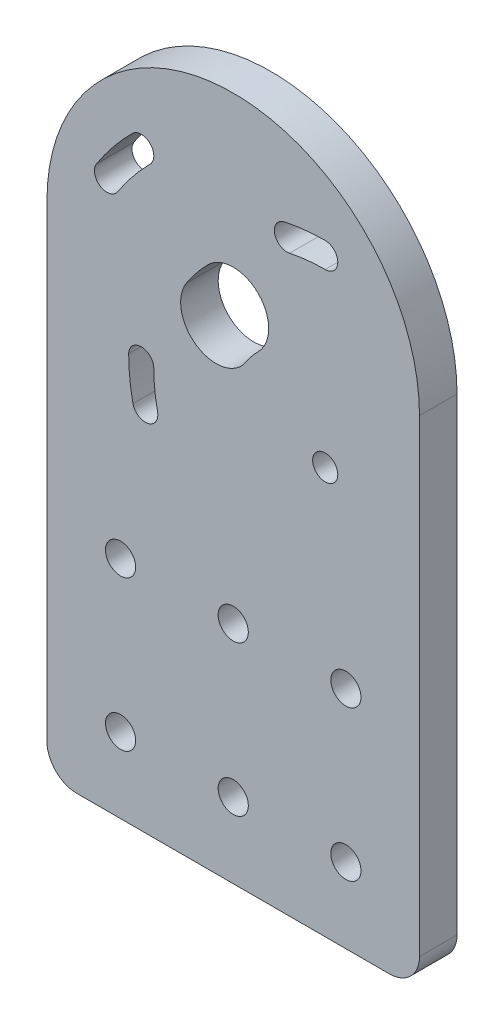
ISO-10303-21;
HEADER;
FILE_DESCRIPTION(('STEP AP214'),'2;1');
FILE_NAME('part.step','',(''),(''),'','','');
FILE_SCHEMA(('AUTOMOTIVE_DESIGN { 1 0 10303 214 1 1 1 1 }'));
ENDSEC;
DATA;
#1=APPLICATION_CONTEXT('core data for automotive mechanical design processes');
#2=APPLICATION_PROTOCOL_DEFINITION('international standard','automotive_design',2000,#1);
#3=PRODUCT_CONTEXT('',#1,'mechanical');
#4=PRODUCT('Part','Part','',(#3));
#5=PRODUCT_RELATED_PRODUCT_CATEGORY('part','',(#4));
#6=PRODUCT_DEFINITION_FORMATION('','',#4);
#7=PRODUCT_DEFINITION_CONTEXT('part definition',#1,'design');
#8=PRODUCT_DEFINITION('design','',#6,#7);
#9=PRODUCT_DEFINITION_SHAPE('','',#8);
#10=(LENGTH_UNIT() NAMED_UNIT(*) SI_UNIT(.MILLI.,.METRE.));
#11=(NAMED_UNIT(*) PLANE_ANGLE_UNIT() SI_UNIT($,.RADIAN.));
#12=(NAMED_UNIT(*) SI_UNIT($,.STERADIAN.) SOLID_ANGLE_UNIT());
#13=UNCERTAINTY_MEASURE_WITH_UNIT(LENGTH_MEASURE(1.E-05),#10,'distance_accuracy_value','');
#14=(GEOMETRIC_REPRESENTATION_CONTEXT(3) GLOBAL_UNCERTAINTY_ASSIGNED_CONTEXT((#13)) GLOBAL_UNIT_ASSIGNED_CONTEXT((#10,
#11,#12)) REPRESENTATION_CONTEXT('',''));
#15=CARTESIAN_POINT('',(0.,0.,0.));
#16=DIRECTION('',(0.,0.,1.));
#17=DIRECTION('',(1.,0.,0.));
#18=AXIS2_PLACEMENT_3D('',#15,#16,#17);
#19=CARTESIAN_POINT('',(0.,84.3,6.35));
#20=DIRECTION('',(0.,0.,1.));
#21=DIRECTION('',(1.,0.,0.));
#22=AXIS2_PLACEMENT_3D('',#19,#20,#21);
#23=PLANE('',#22);
#24=CARTESIAN_POINT('',(-19.0499999999999,12.7,6.35));
#25=DIRECTION('',(0.,0.,1.));
#26=DIRECTION('',(1.,0.,0.));
#27=AXIS2_PLACEMENT_3D('',#24,#25,#26);
#28=CIRCLE('',#27,2.5527);
#29=CARTESIAN_POINT('',(-16.4972999999998,12.7,6.35));
#30=VERTEX_POINT('',#29);
#31=EDGE_CURVE('E325',#30,#30,#28,.T.);
#32=ORIENTED_EDGE('',*,*,#31,.F.);
#33=EDGE_LOOP('',(#32));
#34=FACE_BOUND('',#33,.T.);
#35=CARTESIAN_POINT('',(-1.49186218934005E-13,38.1,6.35));
#36=DIRECTION('',(0.,0.,1.));
#37=DIRECTION('',(1.,0.,0.));
#38=AXIS2_PLACEMENT_3D('',#35,#36,#37);
#39=CIRCLE('',#38,2.5527);
#40=CARTESIAN_POINT('',(2.55269999999985,38.1,6.35));
#41=VERTEX_POINT('',#40);
#42=EDGE_CURVE('E337',#41,#41,#39,.T.);
#43=ORIENTED_EDGE('',*,*,#42,.F.);
#44=EDGE_LOOP('',(#43));
#45=FACE_BOUND('',#44,.T.);
#46=CARTESIAN_POINT('',(19.0500000000001,12.7,6.35));
#47=DIRECTION('',(0.,0.,1.));
#48=DIRECTION('',(1.,0.,0.));
#49=AXIS2_PLACEMENT_3D('',#46,#47,#48);
#50=CIRCLE('',#49,2.5527);
#51=CARTESIAN_POINT('',(21.6027000000002,12.7,6.35));
#52=VERTEX_POINT('',#51);
#53=EDGE_CURVE('E349',#52,#52,#50,.T.);
#54=ORIENTED_EDGE('',*,*,#53,.F.);
#55=EDGE_LOOP('',(#54));
#56=FACE_BOUND('',#55,.T.);
#57=DIRECTION('',(0.,-1.,0.));
#58=VECTOR('',#57,1.);
#59=CARTESIAN_POINT('',(-31.499999992,84.3,6.35));
#60=LINE('',#59,#58);
#61=CARTESIAN_POINT('',(-31.499999992,84.3,6.35));
#62=VERTEX_POINT('',#61);
#63=CARTESIAN_POINT('',(-31.499999992,5.08,6.35));
#64=VERTEX_POINT('',#63);
#65=EDGE_CURVE('E364',#62,#64,#60,.T.);
#66=ORIENTED_EDGE('',*,*,#65,.T.);
#67=CARTESIAN_POINT('',(-26.419999992,5.08,6.35));
#68=DIRECTION('',(0.,0.,1.));
#69=DIRECTION('',(1.,0.,0.));
#70=AXIS2_PLACEMENT_3D('',#67,#68,#69);
#71=CIRCLE('',#70,5.08);
#72=CARTESIAN_POINT('',(-26.419999992,0.,6.35));
#73=VERTEX_POINT('',#72);
#74=EDGE_CURVE('E41',#64,#73,#71,.T.);
#75=ORIENTED_EDGE('',*,*,#74,.T.);
#76=DIRECTION('',(1.,0.,0.));
#77=VECTOR('',#76,1.);
#78=CARTESIAN_POINT('',(-31.499999992,0.,6.35));
#79=LINE('',#78,#77);
#80=CARTESIAN_POINT('',(26.419999992,0.,6.35));
#81=VERTEX_POINT('',#80);
#82=EDGE_CURVE('E367',#73,#81,#79,.T.);
#83=ORIENTED_EDGE('',*,*,#82,.T.);
#84=CARTESIAN_POINT('',(26.419999992,5.07999999999999,6.35));
#85=DIRECTION('',(0.,0.,1.));
#86=DIRECTION('',(1.,0.,0.));
#87=AXIS2_PLACEMENT_3D('',#84,#85,#86);
#88=CIRCLE('',#87,5.08);
#89=CARTESIAN_POINT('',(31.499999992,5.07999999999999,6.35));
#90=VERTEX_POINT('',#89);
#91=EDGE_CURVE('E48',#81,#90,#88,.T.);
#92=ORIENTED_EDGE('',*,*,#91,.T.);
#93=DIRECTION('',(0.,1.,0.));
#94=VECTOR('',#93,1.);
#95=CARTESIAN_POINT('',(31.499999992,0.,6.35));
#96=LINE('',#95,#94);
#97=CARTESIAN_POINT('',(31.499999992,84.3,6.35));
#98=VERTEX_POINT('',#97);
#99=EDGE_CURVE('E369',#90,#98,#96,.T.);
#100=ORIENTED_EDGE('',*,*,#99,.T.);
#101=CARTESIAN_POINT('',(0.,84.3,6.35));
#102=DIRECTION('',(0.,0.,1.));
#103=DIRECTION('',(1.,0.,0.));
#104=AXIS2_PLACEMENT_3D('',#101,#102,#103);
#105=CIRCLE('',#104,31.499999992);
#106=EDGE_CURVE('E361',#98,#62,#105,.T.);
#107=ORIENTED_EDGE('',*,*,#106,.T.);
#108=EDGE_LOOP('',(#66,#75,#83,#92,#100,#107));
#109=FACE_BOUND('',#108,.T.);
#110=CARTESIAN_POINT('',(15.556349186104,68.743650813896,6.35));
#111=DIRECTION('',(0.,0.,1.));
#112=DIRECTION('',(1.,0.,0.));
#113=AXIS2_PLACEMENT_3D('',#110,#111,#112);
#114=CIRCLE('',#113,2.125);
#115=CARTESIAN_POINT('',(17.6813491861041,68.743650813896,6.35));
#116=VERTEX_POINT('',#115);
#117=EDGE_CURVE('E355',#116,#116,#114,.T.);
#118=ORIENTED_EDGE('',*,*,#117,.F.);
#119=EDGE_LOOP('',(#118));
#120=FACE_BOUND('',#119,.T.);
#121=CARTESIAN_POINT('',(1.49186218934005E-13,12.7,6.35));
#122=DIRECTION('',(0.,0.,1.));
#123=DIRECTION('',(1.,0.,0.));
#124=AXIS2_PLACEMENT_3D('',#121,#122,#123);
#125=CIRCLE('',#124,2.5527);
#126=CARTESIAN_POINT('',(2.55270000000015,12.7,6.35));
#127=VERTEX_POINT('',#126);
#128=EDGE_CURVE('E343',#127,#127,#125,.T.);
#129=ORIENTED_EDGE('',*,*,#128,.F.);
#130=EDGE_LOOP('',(#129));
#131=FACE_BOUND('',#130,.T.);
#132=CARTESIAN_POINT('',(19.0499999999999,38.1,6.35));
#133=DIRECTION('',(0.,0.,1.));
#134=DIRECTION('',(1.,0.,0.));
#135=AXIS2_PLACEMENT_3D('',#132,#133,#134);
#136=CIRCLE('',#135,2.5527);
#137=CARTESIAN_POINT('',(21.6026999999999,38.1,6.35));
#138=VERTEX_POINT('',#137);
#139=EDGE_CURVE('E331',#138,#138,#136,.T.);
#140=ORIENTED_EDGE('',*,*,#139,.F.);
#141=EDGE_LOOP('',(#140));
#142=FACE_BOUND('',#141,.T.);
#143=CARTESIAN_POINT('',(-19.0500000000001,38.1,6.35));
#144=DIRECTION('',(0.,0.,1.));
#145=DIRECTION('',(1.,0.,0.));
#146=AXIS2_PLACEMENT_3D('',#143,#144,#145);
#147=CIRCLE('',#146,2.5527);
#148=CARTESIAN_POINT('',(-16.4973000000002,38.1,6.35));
#149=VERTEX_POINT('',#148);
#150=EDGE_CURVE('E319',#149,#149,#147,.T.);
#151=ORIENTED_EDGE('',*,*,#150,.F.);
#152=EDGE_LOOP('',(#151));
#153=FACE_BOUND('',#152,.T.);
#154=CARTESIAN_POINT('',(15.556349186104,68.743650813896,6.35));
#155=DIRECTION('',(0.,0.,1.));
#156=DIRECTION('',(1.,0.,0.));
#157=AXIS2_PLACEMENT_3D('',#154,#155,#156);
#158=CIRCLE('',#157,33.2376983722081);
#159=CARTESIAN_POINT('',(15.556349186104,101.981349186104,6.35));
#160=VERTEX_POINT('',#159);
#161=CARTESIAN_POINT('',(8.64584311864779,101.255025730585,6.35));
#162=VERTEX_POINT('',#161);
#163=EDGE_CURVE('E290',#160,#162,#158,.T.);
#164=ORIENTED_EDGE('',*,*,#163,.F.);
#165=CARTESIAN_POINT('',(15.556349186104,99.856349186104,6.35));
#166=DIRECTION('',(0.,0.,1.));
#167=DIRECTION('',(1.,0.,0.));
#168=AXIS2_PLACEMENT_3D('',#165,#166,#167);
#169=CIRCLE('',#168,2.125);
#170=CARTESIAN_POINT('',(15.556349186104,97.731349186104,6.35));
#171=VERTEX_POINT('',#170);
#172=EDGE_CURVE('E288',#171,#160,#169,.T.);
#173=ORIENTED_EDGE('',*,*,#172,.F.);
#174=CARTESIAN_POINT('',(15.556349186104,68.743650813896,6.35));
#175=DIRECTION('',(0.,0.,-1.));
#176=DIRECTION('',(1.,0.,0.));
#177=AXIS2_PLACEMENT_3D('',#174,#175,#176);
#178=CIRCLE('',#177,28.9876983722081);
#179=CARTESIAN_POINT('',(9.52946780462324,97.0978984274666,6.35));
#180=VERTEX_POINT('',#179);
#181=EDGE_CURVE('E296',#180,#171,#178,.T.);
#182=ORIENTED_EDGE('',*,*,#181,.F.);
#183=CARTESIAN_POINT('',(9.08765546163552,99.1764620790259,6.35));
#184=DIRECTION('',(0.,0.,1.));
#185=DIRECTION('',(1.,0.,0.));
#186=AXIS2_PLACEMENT_3D('',#183,#184,#185);
#187=CIRCLE('',#186,2.125);
#188=EDGE_CURVE('E293',#162,#180,#187,.T.);
#189=ORIENTED_EDGE('',*,*,#188,.F.);
#190=EDGE_LOOP('',(#164,#173,#182,#189));
#191=FACE_BOUND('',#190,.T.);
#192=CARTESIAN_POINT('',(15.556349186104,68.743650813896,6.35));
#193=DIRECTION('',(0.,0.,1.));
#194=DIRECTION('',(1.,0.,0.));
#195=AXIS2_PLACEMENT_3D('',#192,#193,#194);
#196=CIRCLE('',#195,33.2376983722081);
#197=CARTESIAN_POINT('',(-17.681349186104,68.743650813896,6.35));
#198=VERTEX_POINT('',#197);
#199=CARTESIAN_POINT('',(-16.9550257305853,61.8331447464397,6.35));
#200=VERTEX_POINT('',#199);
#201=EDGE_CURVE('E259',#198,#200,#196,.T.);
#202=ORIENTED_EDGE('',*,*,#201,.F.);
#203=CARTESIAN_POINT('',(-15.5563491861041,68.743650813896,6.35));
#204=DIRECTION('',(0.,0.,1.));
#205=DIRECTION('',(1.,0.,0.));
#206=AXIS2_PLACEMENT_3D('',#203,#204,#205);
#207=CIRCLE('',#206,2.125);
#208=CARTESIAN_POINT('',(-13.431349186104,68.7436508138959,6.35));
#209=VERTEX_POINT('',#208);
#210=EDGE_CURVE('E257',#209,#198,#207,.T.);
#211=ORIENTED_EDGE('',*,*,#210,.F.);
#212=CARTESIAN_POINT('',(15.556349186104,68.743650813896,6.35));
#213=DIRECTION('',(0.,0.,-1.));
#214=DIRECTION('',(1.,0.,0.));
#215=AXIS2_PLACEMENT_3D('',#212,#213,#214);
#216=CIRCLE('',#215,28.9876983722081);
#217=CARTESIAN_POINT('',(-12.7978984274666,62.7167694324151,6.35));
#218=VERTEX_POINT('',#217);
#219=EDGE_CURVE('E265',#218,#209,#216,.T.);
#220=ORIENTED_EDGE('',*,*,#219,.F.);
#221=CARTESIAN_POINT('',(-14.8764620790259,62.2749570894274,6.35));
#222=DIRECTION('',(0.,0.,1.));
#223=DIRECTION('',(1.,0.,0.));
#224=AXIS2_PLACEMENT_3D('',#221,#222,#223);
#225=CIRCLE('',#224,2.125);
#226=EDGE_CURVE('E262',#200,#218,#225,.T.);
#227=ORIENTED_EDGE('',*,*,#226,.F.);
#228=EDGE_LOOP('',(#202,#211,#220,#227));
#229=FACE_BOUND('',#228,.T.);
#230=CARTESIAN_POINT('',(15.556349186104,68.743650813896,6.35));
#231=DIRECTION('',(0.,0.,1.));
#232=DIRECTION('',(1.,0.,0.));
#233=AXIS2_PLACEMENT_3D('',#230,#231,#232);
#234=CIRCLE('',#233,46.1249999999999);
#235=CARTESIAN_POINT('',(-17.0589510961254,101.358951096125,6.35));
#236=VERTEX_POINT('',#235);
#237=CARTESIAN_POINT('',(-23.1273307603784,93.8651263039643,6.35));
#238=VERTEX_POINT('',#237);
#239=EDGE_CURVE('E228',#236,#238,#234,.T.);
#240=ORIENTED_EDGE('',*,*,#239,.F.);
#241=CARTESIAN_POINT('',(-15.556349186104,99.856349186104,6.35));
#242=DIRECTION('',(0.,0.,1.));
#243=DIRECTION('',(1.,0.,0.));
#244=AXIS2_PLACEMENT_3D('',#241,#242,#243);
#245=CIRCLE('',#244,2.12499999999997);
#246=CARTESIAN_POINT('',(-14.0537472760826,98.3537472760826,6.35));
#247=VERTEX_POINT('',#246);
#248=EDGE_CURVE('E226',#247,#236,#245,.T.);
#249=ORIENTED_EDGE('',*,*,#248,.F.);
#250=CARTESIAN_POINT('',(15.556349186104,68.743650813896,6.35));
#251=DIRECTION('',(0.,0.,-1.));
#252=DIRECTION('',(1.,0.,0.));
#253=AXIS2_PLACEMENT_3D('',#250,#251,#252);
#254=CIRCLE('',#253,41.875);
#255=CARTESIAN_POINT('',(-19.5629808466104,91.5504104051504,6.35));
#256=VERTEX_POINT('',#255);
#257=EDGE_CURVE('E234',#256,#247,#254,.T.);
#258=ORIENTED_EDGE('',*,*,#257,.F.);
#259=CARTESIAN_POINT('',(-21.3451558034944,92.7077683545573,6.35));
#260=DIRECTION('',(0.,0.,1.));
#261=DIRECTION('',(1.,0.,0.));
#262=AXIS2_PLACEMENT_3D('',#259,#260,#261);
#263=CIRCLE('',#262,2.125);
#264=EDGE_CURVE('E231',#238,#256,#263,.T.);
#265=ORIENTED_EDGE('',*,*,#264,.F.);
#266=EDGE_LOOP('',(#240,#249,#258,#265));
#267=FACE_BOUND('',#266,.T.);
#268=CARTESIAN_POINT('',(15.556349186104,68.743650813896,6.35));
#269=DIRECTION('',(0.,0.,1.));
#270=DIRECTION('',(1.,0.,0.));
#271=AXIS2_PLACEMENT_3D('',#268,#269,#270);
#272=CIRCLE('',#271,28.);
#273=CARTESIAN_POINT('',(-4.24264068711929,88.5426406871192,6.35));
#274=VERTEX_POINT('',#273);
#275=CARTESIAN_POINT('',(-7.92642671636774,83.9935437943168,6.35));
#276=VERTEX_POINT('',#275);
#277=EDGE_CURVE('E195',#274,#276,#272,.T.);
#278=ORIENTED_EDGE('',*,*,#277,.F.);
#279=CARTESIAN_POINT('',(0.,84.3,6.35));
#280=DIRECTION('',(0.,0.,1.));
#281=DIRECTION('',(1.,0.,0.));
#282=AXIS2_PLACEMENT_3D('',#279,#280,#281);
#283=CIRCLE('',#282,6.);
#284=CARTESIAN_POINT('',(4.24264068711928,80.0573593128807,6.35));
#285=VERTEX_POINT('',#284);
#286=EDGE_CURVE('E185',#285,#274,#283,.T.);
#287=ORIENTED_EDGE('',*,*,#286,.F.);
#288=CARTESIAN_POINT('',(15.556349186104,68.743650813896,6.35));
#289=DIRECTION('',(0.,0.,-1.));
#290=DIRECTION('',(1.,0.,0.));
#291=AXIS2_PLACEMENT_3D('',#288,#289,#290);
#292=CIRCLE('',#291,16.);
#293=CARTESIAN_POINT('',(2.1376200989773,77.4578753741364,6.35));
#294=VERTEX_POINT('',#293);
#295=EDGE_CURVE('E210',#294,#285,#292,.T.);
#296=ORIENTED_EDGE('',*,*,#295,.F.);
#297=CARTESIAN_POINT('',(-2.89440330869522,80.7257095842266,6.35));
#298=DIRECTION('',(0.,0.,1.));
#299=DIRECTION('',(1.,0.,0.));
#300=AXIS2_PLACEMENT_3D('',#297,#298,#299);
#301=CIRCLE('',#300,6.);
#302=EDGE_CURVE('E208',#276,#294,#301,.T.);
#303=ORIENTED_EDGE('',*,*,#302,.F.);
#304=EDGE_LOOP('',(#278,#287,#296,#303));
#305=FACE_BOUND('',#304,.T.);
#306=ADVANCED_FACE('F33',(#34,#45,#56,#109,#120,#131,#142,#153,#191,#229,#267,#305),#23,.T.);
#307=CARTESIAN_POINT('',(0.,84.3,0.));
#308=DIRECTION('',(0.,0.,1.));
#309=DIRECTION('',(1.,0.,0.));
#310=AXIS2_PLACEMENT_3D('',#307,#308,#309);
#311=PLANE('',#310);
#312=CARTESIAN_POINT('',(-15.556349186104,99.856349186104,0.));
#313=DIRECTION('',(0.,0.,1.));
#314=DIRECTION('',(1.,0.,0.));
#315=AXIS2_PLACEMENT_3D('',#312,#313,#314);
#316=CIRCLE('',#315,2.12499999999997);
#317=CARTESIAN_POINT('',(-14.0537472760826,98.3537472760826,0.));
#318=VERTEX_POINT('',#317);
#319=CARTESIAN_POINT('',(-17.0589510961254,101.358951096125,0.));
#320=VERTEX_POINT('',#319);
#321=EDGE_CURVE('E203',#318,#320,#316,.T.);
#322=ORIENTED_EDGE('',*,*,#321,.T.);
#323=CARTESIAN_POINT('',(15.556349186104,68.743650813896,0.));
#324=DIRECTION('',(0.,0.,1.));
#325=DIRECTION('',(1.,0.,0.));
#326=AXIS2_PLACEMENT_3D('',#323,#324,#325);
#327=CIRCLE('',#326,46.1249999999999);
#328=CARTESIAN_POINT('',(-23.1273307603784,93.8651263039643,0.));
#329=VERTEX_POINT('',#328);
#330=EDGE_CURVE('E239',#320,#329,#327,.T.);
#331=ORIENTED_EDGE('',*,*,#330,.T.);
#332=CARTESIAN_POINT('',(-21.3451558034944,92.7077683545573,0.));
#333=DIRECTION('',(0.,0.,1.));
#334=DIRECTION('',(1.,0.,0.));
#335=AXIS2_PLACEMENT_3D('',#332,#333,#334);
#336=CIRCLE('',#335,2.125);
#337=CARTESIAN_POINT('',(-19.5629808466104,91.5504104051504,0.));
#338=VERTEX_POINT('',#337);
#339=EDGE_CURVE('E242',#329,#338,#336,.T.);
#340=ORIENTED_EDGE('',*,*,#339,.T.);
#341=CARTESIAN_POINT('',(15.556349186104,68.743650813896,0.));
#342=DIRECTION('',(0.,0.,-1.));
#343=DIRECTION('',(1.,0.,0.));
#344=AXIS2_PLACEMENT_3D('',#341,#342,#343);
#345=CIRCLE('',#344,41.875);
#346=EDGE_CURVE('E229',#338,#318,#345,.T.);
#347=ORIENTED_EDGE('',*,*,#346,.T.);
#348=EDGE_LOOP('',(#322,#331,#340,#347));
#349=FACE_BOUND('',#348,.T.);
#350=CARTESIAN_POINT('',(15.556349186104,99.856349186104,0.));
#351=DIRECTION('',(0.,0.,1.));
#352=DIRECTION('',(1.,0.,0.));
#353=AXIS2_PLACEMENT_3D('',#350,#351,#352);
#354=CIRCLE('',#353,2.125);
#355=CARTESIAN_POINT('',(15.556349186104,97.731349186104,0.));
#356=VERTEX_POINT('',#355);
#357=CARTESIAN_POINT('',(15.556349186104,101.981349186104,0.));
#358=VERTEX_POINT('',#357);
#359=EDGE_CURVE('E287',#356,#358,#354,.T.);
#360=ORIENTED_EDGE('',*,*,#359,.T.);
#361=CARTESIAN_POINT('',(15.556349186104,68.743650813896,0.));
#362=DIRECTION('',(0.,0.,1.));
#363=DIRECTION('',(1.,0.,0.));
#364=AXIS2_PLACEMENT_3D('',#361,#362,#363);
#365=CIRCLE('',#364,33.2376983722081);
#366=CARTESIAN_POINT('',(8.64584311864779,101.255025730585,0.));
#367=VERTEX_POINT('',#366);
#368=EDGE_CURVE('E301',#358,#367,#365,.T.);
#369=ORIENTED_EDGE('',*,*,#368,.T.);
#370=CARTESIAN_POINT('',(9.08765546163552,99.1764620790259,0.));
#371=DIRECTION('',(0.,0.,1.));
#372=DIRECTION('',(1.,0.,0.));
#373=AXIS2_PLACEMENT_3D('',#370,#371,#372);
#374=CIRCLE('',#373,2.125);
#375=CARTESIAN_POINT('',(9.52946780462325,97.0978984274666,0.));
#376=VERTEX_POINT('',#375);
#377=EDGE_CURVE('E304',#367,#376,#374,.T.);
#378=ORIENTED_EDGE('',*,*,#377,.T.);
#379=CARTESIAN_POINT('',(15.556349186104,68.743650813896,0.));
#380=DIRECTION('',(0.,0.,-1.));
#381=DIRECTION('',(1.,0.,0.));
#382=AXIS2_PLACEMENT_3D('',#379,#380,#381);
#383=CIRCLE('',#382,28.9876983722081);
#384=EDGE_CURVE('E291',#376,#356,#383,.T.);
#385=ORIENTED_EDGE('',*,*,#384,.T.);
#386=EDGE_LOOP('',(#360,#369,#378,#385));
#387=FACE_BOUND('',#386,.T.);
#388=DIRECTION('',(1.,0.,0.));
#389=VECTOR('',#388,1.);
#390=CARTESIAN_POINT('',(-31.499999992,0.,0.));
#391=LINE('',#390,#389);
#392=CARTESIAN_POINT('',(-26.419999992,0.,0.));
#393=VERTEX_POINT('',#392);
#394=CARTESIAN_POINT('',(26.419999992,0.,0.));
#395=VERTEX_POINT('',#394);
#396=EDGE_CURVE('E376',#393,#395,#391,.T.);
#397=ORIENTED_EDGE('',*,*,#396,.F.);
#398=CARTESIAN_POINT('',(-26.419999992,5.08,0.));
#399=DIRECTION('',(0.,0.,1.));
#400=DIRECTION('',(1.,0.,0.));
#401=AXIS2_PLACEMENT_3D('',#398,#399,#400);
#402=CIRCLE('',#401,5.08);
#403=CARTESIAN_POINT('',(-31.499999992,5.08,0.));
#404=VERTEX_POINT('',#403);
#405=EDGE_CURVE('E392',#393,#404,#402,.F.);
#406=ORIENTED_EDGE('',*,*,#405,.T.);
#407=DIRECTION('',(0.,-1.,0.));
#408=VECTOR('',#407,1.);
#409=CARTESIAN_POINT('',(-31.499999992,84.3,0.));
#410=LINE('',#409,#408);
#411=CARTESIAN_POINT('',(-31.499999992,84.3,0.));
#412=VERTEX_POINT('',#411);
#413=EDGE_CURVE('E374',#412,#404,#410,.T.);
#414=ORIENTED_EDGE('',*,*,#413,.F.);
#415=CARTESIAN_POINT('',(0.,84.3,0.));
#416=DIRECTION('',(0.,0.,1.));
#417=DIRECTION('',(1.,0.,0.));
#418=AXIS2_PLACEMENT_3D('',#415,#416,#417);
#419=CIRCLE('',#418,31.499999992);
#420=CARTESIAN_POINT('',(31.499999992,84.3,0.));
#421=VERTEX_POINT('',#420);
#422=EDGE_CURVE('E358',#421,#412,#419,.T.);
#423=ORIENTED_EDGE('',*,*,#422,.F.);
#424=DIRECTION('',(0.,1.,0.));
#425=VECTOR('',#424,1.);
#426=CARTESIAN_POINT('',(31.499999992,0.,0.));
#427=LINE('',#426,#425);
#428=CARTESIAN_POINT('',(31.499999992,5.07999999999999,0.));
#429=VERTEX_POINT('',#428);
#430=EDGE_CURVE('E365',#429,#421,#427,.T.);
#431=ORIENTED_EDGE('',*,*,#430,.F.);
#432=CARTESIAN_POINT('',(26.419999992,5.07999999999999,0.));
#433=DIRECTION('',(0.,0.,1.));
#434=DIRECTION('',(1.,0.,0.));
#435=AXIS2_PLACEMENT_3D('',#432,#433,#434);
#436=CIRCLE('',#435,5.08);
#437=EDGE_CURVE('E390',#429,#395,#436,.F.);
#438=ORIENTED_EDGE('',*,*,#437,.T.);
#439=EDGE_LOOP('',(#397,#406,#414,#423,#431,#438));
#440=FACE_BOUND('',#439,.T.);
#441=CARTESIAN_POINT('',(15.556349186104,68.743650813896,0.));
#442=DIRECTION('',(0.,0.,1.));
#443=DIRECTION('',(1.,0.,0.));
#444=AXIS2_PLACEMENT_3D('',#441,#442,#443);
#445=CIRCLE('',#444,2.125);
#446=CARTESIAN_POINT('',(17.6813491861041,68.743650813896,0.));
#447=VERTEX_POINT('',#446);
#448=EDGE_CURVE('E352',#447,#447,#445,.T.);
#449=ORIENTED_EDGE('',*,*,#448,.T.);
#450=EDGE_LOOP('',(#449));
#451=FACE_BOUND('',#450,.T.);
#452=CARTESIAN_POINT('',(19.0500000000001,12.7,0.));
#453=DIRECTION('',(0.,0.,1.));
#454=DIRECTION('',(1.,0.,0.));
#455=AXIS2_PLACEMENT_3D('',#452,#453,#454);
#456=CIRCLE('',#455,2.5527);
#457=CARTESIAN_POINT('',(21.6027000000002,12.7,0.));
#458=VERTEX_POINT('',#457);
#459=EDGE_CURVE('E346',#458,#458,#456,.T.);
#460=ORIENTED_EDGE('',*,*,#459,.T.);
#461=EDGE_LOOP('',(#460));
#462=FACE_BOUND('',#461,.T.);
#463=CARTESIAN_POINT('',(1.49186218934005E-13,12.7,0.));
#464=DIRECTION('',(0.,0.,1.));
#465=DIRECTION('',(1.,0.,0.));
#466=AXIS2_PLACEMENT_3D('',#463,#464,#465);
#467=CIRCLE('',#466,2.5527);
#468=CARTESIAN_POINT('',(2.55270000000015,12.7,0.));
#469=VERTEX_POINT('',#468);
#470=EDGE_CURVE('E340',#469,#469,#467,.T.);
#471=ORIENTED_EDGE('',*,*,#470,.T.);
#472=EDGE_LOOP('',(#471));
#473=FACE_BOUND('',#472,.T.);
#474=CARTESIAN_POINT('',(-1.49186218934005E-13,38.1,0.));
#475=DIRECTION('',(0.,0.,1.));
#476=DIRECTION('',(1.,0.,0.));
#477=AXIS2_PLACEMENT_3D('',#474,#475,#476);
#478=CIRCLE('',#477,2.5527);
#479=CARTESIAN_POINT('',(2.55269999999985,38.1,0.));
#480=VERTEX_POINT('',#479);
#481=EDGE_CURVE('E334',#480,#480,#478,.T.);
#482=ORIENTED_EDGE('',*,*,#481,.T.);
#483=EDGE_LOOP('',(#482));
#484=FACE_BOUND('',#483,.T.);
#485=CARTESIAN_POINT('',(19.0499999999999,38.1,0.));
#486=DIRECTION('',(0.,0.,1.));
#487=DIRECTION('',(1.,0.,0.));
#488=AXIS2_PLACEMENT_3D('',#485,#486,#487);
#489=CIRCLE('',#488,2.5527);
#490=CARTESIAN_POINT('',(21.6026999999999,38.1,0.));
#491=VERTEX_POINT('',#490);
#492=EDGE_CURVE('E328',#491,#491,#489,.T.);
#493=ORIENTED_EDGE('',*,*,#492,.T.);
#494=EDGE_LOOP('',(#493));
#495=FACE_BOUND('',#494,.T.);
#496=CARTESIAN_POINT('',(-19.0499999999999,12.7,0.));
#497=DIRECTION('',(0.,0.,1.));
#498=DIRECTION('',(1.,0.,0.));
#499=AXIS2_PLACEMENT_3D('',#496,#497,#498);
#500=CIRCLE('',#499,2.5527);
#501=CARTESIAN_POINT('',(-16.4972999999998,12.7,0.));
#502=VERTEX_POINT('',#501);
#503=EDGE_CURVE('E322',#502,#502,#500,.T.);
#504=ORIENTED_EDGE('',*,*,#503,.T.);
#505=EDGE_LOOP('',(#504));
#506=FACE_BOUND('',#505,.T.);
#507=CARTESIAN_POINT('',(-19.0500000000001,38.1,0.));
#508=DIRECTION('',(0.,0.,1.));
#509=DIRECTION('',(1.,0.,0.));
#510=AXIS2_PLACEMENT_3D('',#507,#508,#509);
#511=CIRCLE('',#510,2.5527);
#512=CARTESIAN_POINT('',(-16.4973000000002,38.1,0.));
#513=VERTEX_POINT('',#512);
#514=EDGE_CURVE('E318',#513,#513,#511,.T.);
#515=ORIENTED_EDGE('',*,*,#514,.T.);
#516=EDGE_LOOP('',(#515));
#517=FACE_BOUND('',#516,.T.);
#518=CARTESIAN_POINT('',(-15.5563491861041,68.743650813896,0.));
#519=DIRECTION('',(0.,0.,1.));
#520=DIRECTION('',(1.,0.,0.));
#521=AXIS2_PLACEMENT_3D('',#518,#519,#520);
#522=CIRCLE('',#521,2.125);
#523=CARTESIAN_POINT('',(-13.431349186104,68.7436508138959,0.));
#524=VERTEX_POINT('',#523);
#525=CARTESIAN_POINT('',(-17.681349186104,68.743650813896,0.));
#526=VERTEX_POINT('',#525);
#527=EDGE_CURVE('E256',#524,#526,#522,.T.);
#528=ORIENTED_EDGE('',*,*,#527,.T.);
#529=CARTESIAN_POINT('',(15.556349186104,68.743650813896,0.));
#530=DIRECTION('',(0.,0.,1.));
#531=DIRECTION('',(1.,0.,0.));
#532=AXIS2_PLACEMENT_3D('',#529,#530,#531);
#533=CIRCLE('',#532,33.2376983722081);
#534=CARTESIAN_POINT('',(-16.9550257305853,61.8331447464397,0.));
#535=VERTEX_POINT('',#534);
#536=EDGE_CURVE('E270',#526,#535,#533,.T.);
#537=ORIENTED_EDGE('',*,*,#536,.T.);
#538=CARTESIAN_POINT('',(-14.8764620790259,62.2749570894274,0.));
#539=DIRECTION('',(0.,0.,1.));
#540=DIRECTION('',(1.,0.,0.));
#541=AXIS2_PLACEMENT_3D('',#538,#539,#540);
#542=CIRCLE('',#541,2.125);
#543=CARTESIAN_POINT('',(-12.7978984274666,62.7167694324151,0.));
#544=VERTEX_POINT('',#543);
#545=EDGE_CURVE('E273',#535,#544,#542,.T.);
#546=ORIENTED_EDGE('',*,*,#545,.T.);
#547=CARTESIAN_POINT('',(15.556349186104,68.743650813896,0.));
#548=DIRECTION('',(0.,0.,-1.));
#549=DIRECTION('',(1.,0.,0.));
#550=AXIS2_PLACEMENT_3D('',#547,#548,#549);
#551=CIRCLE('',#550,28.9876983722081);
#552=EDGE_CURVE('E260',#544,#524,#551,.T.);
#553=ORIENTED_EDGE('',*,*,#552,.T.);
#554=EDGE_LOOP('',(#528,#537,#546,#553));
#555=FACE_BOUND('',#554,.T.);
#556=CARTESIAN_POINT('',(0.,84.3,0.));
#557=DIRECTION('',(0.,0.,1.));
#558=DIRECTION('',(1.,0.,0.));
#559=AXIS2_PLACEMENT_3D('',#556,#557,#558);
#560=CIRCLE('',#559,6.);
#561=CARTESIAN_POINT('',(4.24264068711928,80.0573593128807,0.));
#562=VERTEX_POINT('',#561);
#563=CARTESIAN_POINT('',(-4.24264068711929,88.5426406871192,0.));
#564=VERTEX_POINT('',#563);
#565=EDGE_CURVE('E214',#562,#564,#560,.T.);
#566=ORIENTED_EDGE('',*,*,#565,.T.);
#567=CARTESIAN_POINT('',(15.556349186104,68.743650813896,0.));
#568=DIRECTION('',(0.,0.,1.));
#569=DIRECTION('',(1.,0.,0.));
#570=AXIS2_PLACEMENT_3D('',#567,#568,#569);
#571=CIRCLE('',#570,28.);
#572=CARTESIAN_POINT('',(-7.92642671636774,83.9935437943168,0.));
#573=VERTEX_POINT('',#572);
#574=EDGE_CURVE('E202',#564,#573,#571,.T.);
#575=ORIENTED_EDGE('',*,*,#574,.T.);
#576=CARTESIAN_POINT('',(-2.89440330869522,80.7257095842266,0.));
#577=DIRECTION('',(0.,0.,1.));
#578=DIRECTION('',(1.,0.,0.));
#579=AXIS2_PLACEMENT_3D('',#576,#577,#578);
#580=CIRCLE('',#579,6.);
#581=CARTESIAN_POINT('',(2.1376200989773,77.4578753741364,0.));
#582=VERTEX_POINT('',#581);
#583=EDGE_CURVE('E217',#573,#582,#580,.T.);
#584=ORIENTED_EDGE('',*,*,#583,.T.);
#585=CARTESIAN_POINT('',(15.556349186104,68.743650813896,0.));
#586=DIRECTION('',(0.,0.,-1.));
#587=DIRECTION('',(1.,0.,0.));
#588=AXIS2_PLACEMENT_3D('',#585,#586,#587);
#589=CIRCLE('',#588,16.);
#590=EDGE_CURVE('E196',#582,#562,#589,.T.);
#591=ORIENTED_EDGE('',*,*,#590,.T.);
#592=EDGE_LOOP('',(#566,#575,#584,#591));
#593=FACE_BOUND('',#592,.T.);
#594=ADVANCED_FACE('F406',(#349,#387,#440,#451,#462,#473,#484,#495,#506,#517,#555,#593),#311,.F.);
#595=CARTESIAN_POINT('',(0.,84.3,6.35));
#596=DIRECTION('',(0.,0.,-1.));
#597=DIRECTION('',(-1.,0.,0.));
#598=AXIS2_PLACEMENT_3D('',#595,#596,#597);
#599=CYLINDRICAL_SURFACE('',#598,31.499999992);
#600=ORIENTED_EDGE('',*,*,#422,.T.);
#601=DIRECTION('',(0.,0.,-1.));
#602=VECTOR('',#601,1.);
#603=CARTESIAN_POINT('',(-31.499999992,84.3,6.35));
#604=LINE('',#603,#602);
#605=EDGE_CURVE('E382',#62,#412,#604,.T.);
#606=ORIENTED_EDGE('',*,*,#605,.F.);
#607=ORIENTED_EDGE('',*,*,#106,.F.);
#608=DIRECTION('',(0.,0.,-1.));
#609=VECTOR('',#608,1.);
#610=CARTESIAN_POINT('',(31.499999992,84.3,6.35));
#611=LINE('',#610,#609);
#612=EDGE_CURVE('E371',#98,#421,#611,.T.);
#613=ORIENTED_EDGE('',*,*,#612,.T.);
#614=EDGE_LOOP('',(#600,#606,#607,#613));
#615=FACE_BOUND('',#614,.T.);
#616=ADVANCED_FACE('F413',(#615),#599,.T.);
#617=CARTESIAN_POINT('',(-31.499999992,84.3,6.35));
#618=DIRECTION('',(1.,0.,0.));
#619=DIRECTION('',(0.,1.,0.));
#620=AXIS2_PLACEMENT_3D('',#617,#618,#619);
#621=PLANE('',#620);
#622=ORIENTED_EDGE('',*,*,#413,.T.);
#623=DIRECTION('',(0.,0.,-1.));
#624=VECTOR('',#623,1.);
#625=CARTESIAN_POINT('',(-31.499999992,5.08,6.35));
#626=LINE('',#625,#624);
#627=EDGE_CURVE('E56',#404,#64,#626,.F.);
#628=ORIENTED_EDGE('',*,*,#627,.T.);
#629=ORIENTED_EDGE('',*,*,#65,.F.);
#630=ORIENTED_EDGE('',*,*,#605,.T.);
#631=EDGE_LOOP('',(#622,#628,#629,#630));
#632=FACE_BOUND('',#631,.T.);
#633=ADVANCED_FACE('F409',(#632),#621,.F.);
#634=CARTESIAN_POINT('',(-31.499999992,0.,6.35));
#635=DIRECTION('',(0.,1.,0.));
#636=DIRECTION('',(-1.,0.,0.));
#637=AXIS2_PLACEMENT_3D('',#634,#635,#636);
#638=PLANE('',#637);
#639=ORIENTED_EDGE('',*,*,#82,.F.);
#640=DIRECTION('',(0.,0.,-1.));
#641=VECTOR('',#640,1.);
#642=CARTESIAN_POINT('',(-26.419999992,0.,6.35));
#643=LINE('',#642,#641);
#644=EDGE_CURVE('E387',#73,#393,#643,.T.);
#645=ORIENTED_EDGE('',*,*,#644,.T.);
#646=ORIENTED_EDGE('',*,*,#396,.T.);
#647=DIRECTION('',(0.,0.,-1.));
#648=VECTOR('',#647,1.);
#649=CARTESIAN_POINT('',(26.419999992,0.,6.35));
#650=LINE('',#649,#648);
#651=EDGE_CURVE('E385',#395,#81,#650,.F.);
#652=ORIENTED_EDGE('',*,*,#651,.T.);
#653=EDGE_LOOP('',(#639,#645,#646,#652));
#654=FACE_BOUND('',#653,.T.);
#655=ADVANCED_FACE('F401',(#654),#638,.F.);
#656=CARTESIAN_POINT('',(31.499999992,0.,6.35));
#657=DIRECTION('',(-1.,0.,0.));
#658=DIRECTION('',(0.,0.,1.));
#659=AXIS2_PLACEMENT_3D('',#656,#657,#658);
#660=PLANE('',#659);
#661=ORIENTED_EDGE('',*,*,#99,.F.);
#662=DIRECTION('',(0.,0.,-1.));
#663=VECTOR('',#662,1.);
#664=CARTESIAN_POINT('',(31.499999992,5.07999999999999,6.35));
#665=LINE('',#664,#663);
#666=EDGE_CURVE('E11',#90,#429,#665,.T.);
#667=ORIENTED_EDGE('',*,*,#666,.T.);
#668=ORIENTED_EDGE('',*,*,#430,.T.);
#669=ORIENTED_EDGE('',*,*,#612,.F.);
#670=EDGE_LOOP('',(#661,#667,#668,#669));
#671=FACE_BOUND('',#670,.T.);
#672=ADVANCED_FACE('F417',(#671),#660,.F.);
#673=CARTESIAN_POINT('',(15.556349186104,68.743650813896,6.35));
#674=DIRECTION('',(0.,0.,-1.));
#675=DIRECTION('',(-1.,0.,0.));
#676=AXIS2_PLACEMENT_3D('',#673,#674,#675);
#677=CYLINDRICAL_SURFACE('',#676,2.125);
#678=ORIENTED_EDGE('',*,*,#117,.T.);
#679=EDGE_LOOP('',(#678));
#680=FACE_BOUND('',#679,.T.);
#681=ORIENTED_EDGE('',*,*,#448,.F.);
#682=EDGE_LOOP('',(#681));
#683=FACE_BOUND('',#682,.T.);
#684=ADVANCED_FACE('F436',(#680,#683),#677,.F.);
#685=CARTESIAN_POINT('',(19.0500000000001,12.7,6.35));
#686=DIRECTION('',(0.,0.,-1.));
#687=DIRECTION('',(-1.,0.,0.));
#688=AXIS2_PLACEMENT_3D('',#685,#686,#687);
#689=CYLINDRICAL_SURFACE('',#688,2.5527);
#690=ORIENTED_EDGE('',*,*,#53,.T.);
#691=EDGE_LOOP('',(#690));
#692=FACE_BOUND('',#691,.T.);
#693=ORIENTED_EDGE('',*,*,#459,.F.);
#694=EDGE_LOOP('',(#693));
#695=FACE_BOUND('',#694,.T.);
#696=ADVANCED_FACE('F469',(#692,#695),#689,.F.);
#697=CARTESIAN_POINT('',(1.49186218934005E-13,12.7,6.35));
#698=DIRECTION('',(0.,0.,-1.));
#699=DIRECTION('',(-1.,0.,0.));
#700=AXIS2_PLACEMENT_3D('',#697,#698,#699);
#701=CYLINDRICAL_SURFACE('',#700,2.5527);
#702=ORIENTED_EDGE('',*,*,#128,.T.);
#703=EDGE_LOOP('',(#702));
#704=FACE_BOUND('',#703,.T.);
#705=ORIENTED_EDGE('',*,*,#470,.F.);
#706=EDGE_LOOP('',(#705));
#707=FACE_BOUND('',#706,.T.);
#708=ADVANCED_FACE('F476',(#704,#707),#701,.F.);
#709=CARTESIAN_POINT('',(-1.49186218934005E-13,38.1,6.35));
#710=DIRECTION('',(0.,0.,-1.));
#711=DIRECTION('',(-1.,0.,0.));
#712=AXIS2_PLACEMENT_3D('',#709,#710,#711);
#713=CYLINDRICAL_SURFACE('',#712,2.5527);
#714=ORIENTED_EDGE('',*,*,#42,.T.);
#715=EDGE_LOOP('',(#714));
#716=FACE_BOUND('',#715,.T.);
#717=ORIENTED_EDGE('',*,*,#481,.F.);
#718=EDGE_LOOP('',(#717));
#719=FACE_BOUND('',#718,.T.);
#720=ADVANCED_FACE('F483',(#716,#719),#713,.F.);
#721=CARTESIAN_POINT('',(19.0499999999999,38.1,6.35));
#722=DIRECTION('',(0.,0.,-1.));
#723=DIRECTION('',(-1.,0.,0.));
#724=AXIS2_PLACEMENT_3D('',#721,#722,#723);
#725=CYLINDRICAL_SURFACE('',#724,2.5527);
#726=ORIENTED_EDGE('',*,*,#139,.T.);
#727=EDGE_LOOP('',(#726));
#728=FACE_BOUND('',#727,.T.);
#729=ORIENTED_EDGE('',*,*,#492,.F.);
#730=EDGE_LOOP('',(#729));
#731=FACE_BOUND('',#730,.T.);
#732=ADVANCED_FACE('F491',(#728,#731),#725,.F.);
#733=CARTESIAN_POINT('',(-19.0499999999999,12.7,6.35));
#734=DIRECTION('',(0.,0.,-1.));
#735=DIRECTION('',(-1.,0.,0.));
#736=AXIS2_PLACEMENT_3D('',#733,#734,#735);
#737=CYLINDRICAL_SURFACE('',#736,2.5527);
#738=ORIENTED_EDGE('',*,*,#31,.T.);
#739=EDGE_LOOP('',(#738));
#740=FACE_BOUND('',#739,.T.);
#741=ORIENTED_EDGE('',*,*,#503,.F.);
#742=EDGE_LOOP('',(#741));
#743=FACE_BOUND('',#742,.T.);
#744=ADVANCED_FACE('F499',(#740,#743),#737,.F.);
#745=CARTESIAN_POINT('',(-19.0500000000001,38.1,6.35));
#746=DIRECTION('',(0.,0.,-1.));
#747=DIRECTION('',(-1.,0.,0.));
#748=AXIS2_PLACEMENT_3D('',#745,#746,#747);
#749=CYLINDRICAL_SURFACE('',#748,2.5527);
#750=ORIENTED_EDGE('',*,*,#150,.T.);
#751=EDGE_LOOP('',(#750));
#752=FACE_BOUND('',#751,.T.);
#753=ORIENTED_EDGE('',*,*,#514,.F.);
#754=EDGE_LOOP('',(#753));
#755=FACE_BOUND('',#754,.T.);
#756=ADVANCED_FACE('F507',(#752,#755),#749,.F.);
#757=CARTESIAN_POINT('',(15.556349186104,99.856349186104,6.35));
#758=DIRECTION('',(0.,0.,-1.));
#759=DIRECTION('',(-1.,0.,0.));
#760=AXIS2_PLACEMENT_3D('',#757,#758,#759);
#761=CYLINDRICAL_SURFACE('',#760,2.125);
#762=ORIENTED_EDGE('',*,*,#359,.F.);
#763=DIRECTION('',(0.,0.,-1.));
#764=VECTOR('',#763,1.);
#765=CARTESIAN_POINT('',(15.556349186104,97.731349186104,6.35));
#766=LINE('',#765,#764);
#767=EDGE_CURVE('E298',#171,#356,#766,.T.);
#768=ORIENTED_EDGE('',*,*,#767,.F.);
#769=ORIENTED_EDGE('',*,*,#172,.T.);
#770=DIRECTION('',(0.,0.,-1.));
#771=VECTOR('',#770,1.);
#772=CARTESIAN_POINT('',(15.556349186104,101.981349186104,6.35));
#773=LINE('',#772,#771);
#774=EDGE_CURVE('E315',#160,#358,#773,.T.);
#775=ORIENTED_EDGE('',*,*,#774,.T.);
#776=EDGE_LOOP('',(#762,#768,#769,#775));
#777=FACE_BOUND('',#776,.T.);
#778=ADVANCED_FACE('F515',(#777),#761,.F.);
#779=CARTESIAN_POINT('',(15.556349186104,68.743650813896,6.35));
#780=DIRECTION('',(0.,0.,-1.));
#781=DIRECTION('',(-1.,0.,0.));
#782=AXIS2_PLACEMENT_3D('',#779,#780,#781);
#783=CYLINDRICAL_SURFACE('',#782,33.2376983722081);
#784=ORIENTED_EDGE('',*,*,#368,.F.);
#785=ORIENTED_EDGE('',*,*,#774,.F.);
#786=ORIENTED_EDGE('',*,*,#163,.T.);
#787=DIRECTION('',(0.,0.,-1.));
#788=VECTOR('',#787,1.);
#789=CARTESIAN_POINT('',(8.64584311864779,101.255025730585,6.35));
#790=LINE('',#789,#788);
#791=EDGE_CURVE('E313',#162,#367,#790,.T.);
#792=ORIENTED_EDGE('',*,*,#791,.T.);
#793=EDGE_LOOP('',(#784,#785,#786,#792));
#794=FACE_BOUND('',#793,.T.);
#795=ADVANCED_FACE('F523',(#794),#783,.F.);
#796=CARTESIAN_POINT('',(9.08765546163552,99.1764620790259,6.35));
#797=DIRECTION('',(0.,0.,-1.));
#798=DIRECTION('',(-1.,0.,0.));
#799=AXIS2_PLACEMENT_3D('',#796,#797,#798);
#800=CYLINDRICAL_SURFACE('',#799,2.125);
#801=ORIENTED_EDGE('',*,*,#377,.F.);
#802=ORIENTED_EDGE('',*,*,#791,.F.);
#803=ORIENTED_EDGE('',*,*,#188,.T.);
#804=DIRECTION('',(0.,0.,-1.));
#805=VECTOR('',#804,1.);
#806=CARTESIAN_POINT('',(9.52946780462325,97.0978984274666,6.35));
#807=LINE('',#806,#805);
#808=EDGE_CURVE('E311',#180,#376,#807,.T.);
#809=ORIENTED_EDGE('',*,*,#808,.T.);
#810=EDGE_LOOP('',(#801,#802,#803,#809));
#811=FACE_BOUND('',#810,.T.);
#812=ADVANCED_FACE('F531',(#811),#800,.F.);
#813=CARTESIAN_POINT('',(15.556349186104,68.743650813896,6.35));
#814=DIRECTION('',(0.,0.,-1.));
#815=DIRECTION('',(-1.,0.,0.));
#816=AXIS2_PLACEMENT_3D('',#813,#814,#815);
#817=CYLINDRICAL_SURFACE('',#816,28.9876983722081);
#818=ORIENTED_EDGE('',*,*,#384,.F.);
#819=ORIENTED_EDGE('',*,*,#808,.F.);
#820=ORIENTED_EDGE('',*,*,#181,.T.);
#821=ORIENTED_EDGE('',*,*,#767,.T.);
#822=EDGE_LOOP('',(#818,#819,#820,#821));
#823=FACE_BOUND('',#822,.T.);
#824=ADVANCED_FACE('F539',(#823),#817,.T.);
#825=CARTESIAN_POINT('',(-15.5563491861041,68.743650813896,6.35));
#826=DIRECTION('',(0.,0.,-1.));
#827=DIRECTION('',(-1.,0.,0.));
#828=AXIS2_PLACEMENT_3D('',#825,#826,#827);
#829=CYLINDRICAL_SURFACE('',#828,2.125);
#830=ORIENTED_EDGE('',*,*,#527,.F.);
#831=DIRECTION('',(0.,0.,-1.));
#832=VECTOR('',#831,1.);
#833=CARTESIAN_POINT('',(-13.431349186104,68.7436508138959,6.35));
#834=LINE('',#833,#832);
#835=EDGE_CURVE('E267',#209,#524,#834,.T.);
#836=ORIENTED_EDGE('',*,*,#835,.F.);
#837=ORIENTED_EDGE('',*,*,#210,.T.);
#838=DIRECTION('',(0.,0.,-1.));
#839=VECTOR('',#838,1.);
#840=CARTESIAN_POINT('',(-17.681349186104,68.743650813896,6.35));
#841=LINE('',#840,#839);
#842=EDGE_CURVE('E284',#198,#526,#841,.T.);
#843=ORIENTED_EDGE('',*,*,#842,.T.);
#844=EDGE_LOOP('',(#830,#836,#837,#843));
#845=FACE_BOUND('',#844,.T.);
#846=ADVANCED_FACE('F547',(#845),#829,.F.);
#847=CARTESIAN_POINT('',(15.556349186104,68.743650813896,6.35));
#848=DIRECTION('',(0.,0.,-1.));
#849=DIRECTION('',(-1.,0.,0.));
#850=AXIS2_PLACEMENT_3D('',#847,#848,#849);
#851=CYLINDRICAL_SURFACE('',#850,33.2376983722081);
#852=ORIENTED_EDGE('',*,*,#536,.F.);
#853=ORIENTED_EDGE('',*,*,#842,.F.);
#854=ORIENTED_EDGE('',*,*,#201,.T.);
#855=DIRECTION('',(0.,0.,-1.));
#856=VECTOR('',#855,1.);
#857=CARTESIAN_POINT('',(-16.9550257305853,61.8331447464397,6.35));
#858=LINE('',#857,#856);
#859=EDGE_CURVE('E282',#200,#535,#858,.T.);
#860=ORIENTED_EDGE('',*,*,#859,.T.);
#861=EDGE_LOOP('',(#852,#853,#854,#860));
#862=FACE_BOUND('',#861,.T.);
#863=ADVANCED_FACE('F555',(#862),#851,.F.);
#864=CARTESIAN_POINT('',(-14.8764620790259,62.2749570894274,6.35));
#865=DIRECTION('',(0.,0.,-1.));
#866=DIRECTION('',(-1.,0.,0.));
#867=AXIS2_PLACEMENT_3D('',#864,#865,#866);
#868=CYLINDRICAL_SURFACE('',#867,2.125);
#869=ORIENTED_EDGE('',*,*,#545,.F.);
#870=ORIENTED_EDGE('',*,*,#859,.F.);
#871=ORIENTED_EDGE('',*,*,#226,.T.);
#872=DIRECTION('',(0.,0.,-1.));
#873=VECTOR('',#872,1.);
#874=CARTESIAN_POINT('',(-12.7978984274666,62.7167694324151,6.35));
#875=LINE('',#874,#873);
#876=EDGE_CURVE('E280',#218,#544,#875,.T.);
#877=ORIENTED_EDGE('',*,*,#876,.T.);
#878=EDGE_LOOP('',(#869,#870,#871,#877));
#879=FACE_BOUND('',#878,.T.);
#880=ADVANCED_FACE('F563',(#879),#868,.F.);
#881=CARTESIAN_POINT('',(15.556349186104,68.743650813896,6.35));
#882=DIRECTION('',(0.,0.,-1.));
#883=DIRECTION('',(-1.,0.,0.));
#884=AXIS2_PLACEMENT_3D('',#881,#882,#883);
#885=CYLINDRICAL_SURFACE('',#884,28.9876983722081);
#886=ORIENTED_EDGE('',*,*,#552,.F.);
#887=ORIENTED_EDGE('',*,*,#876,.F.);
#888=ORIENTED_EDGE('',*,*,#219,.T.);
#889=ORIENTED_EDGE('',*,*,#835,.T.);
#890=EDGE_LOOP('',(#886,#887,#888,#889));
#891=FACE_BOUND('',#890,.T.);
#892=ADVANCED_FACE('F571',(#891),#885,.T.);
#893=CARTESIAN_POINT('',(-15.556349186104,99.856349186104,6.35));
#894=DIRECTION('',(0.,0.,-1.));
#895=DIRECTION('',(-1.,0.,0.));
#896=AXIS2_PLACEMENT_3D('',#893,#894,#895);
#897=CYLINDRICAL_SURFACE('',#896,2.12499999999997);
#898=ORIENTED_EDGE('',*,*,#321,.F.);
#899=DIRECTION('',(0.,0.,-1.));
#900=VECTOR('',#899,1.);
#901=CARTESIAN_POINT('',(-14.0537472760826,98.3537472760826,6.35));
#902=LINE('',#901,#900);
#903=EDGE_CURVE('E236',#247,#318,#902,.T.);
#904=ORIENTED_EDGE('',*,*,#903,.F.);
#905=ORIENTED_EDGE('',*,*,#248,.T.);
#906=DIRECTION('',(0.,0.,-1.));
#907=VECTOR('',#906,1.);
#908=CARTESIAN_POINT('',(-17.0589510961254,101.358951096125,6.35));
#909=LINE('',#908,#907);
#910=EDGE_CURVE('E253',#236,#320,#909,.T.);
#911=ORIENTED_EDGE('',*,*,#910,.T.);
#912=EDGE_LOOP('',(#898,#904,#905,#911));
#913=FACE_BOUND('',#912,.T.);
#914=ADVANCED_FACE('F579',(#913),#897,.F.);
#915=CARTESIAN_POINT('',(15.556349186104,68.743650813896,6.35));
#916=DIRECTION('',(0.,0.,-1.));
#917=DIRECTION('',(-1.,0.,0.));
#918=AXIS2_PLACEMENT_3D('',#915,#916,#917);
#919=CYLINDRICAL_SURFACE('',#918,46.1249999999999);
#920=ORIENTED_EDGE('',*,*,#330,.F.);
#921=ORIENTED_EDGE('',*,*,#910,.F.);
#922=ORIENTED_EDGE('',*,*,#239,.T.);
#923=DIRECTION('',(0.,0.,-1.));
#924=VECTOR('',#923,1.);
#925=CARTESIAN_POINT('',(-23.1273307603784,93.8651263039643,6.35));
#926=LINE('',#925,#924);
#927=EDGE_CURVE('E251',#238,#329,#926,.T.);
#928=ORIENTED_EDGE('',*,*,#927,.T.);
#929=EDGE_LOOP('',(#920,#921,#922,#928));
#930=FACE_BOUND('',#929,.T.);
#931=ADVANCED_FACE('F587',(#930),#919,.F.);
#932=CARTESIAN_POINT('',(-21.3451558034944,92.7077683545573,6.35));
#933=DIRECTION('',(0.,0.,-1.));
#934=DIRECTION('',(-1.,0.,0.));
#935=AXIS2_PLACEMENT_3D('',#932,#933,#934);
#936=CYLINDRICAL_SURFACE('',#935,2.125);
#937=ORIENTED_EDGE('',*,*,#339,.F.);
#938=ORIENTED_EDGE('',*,*,#927,.F.);
#939=ORIENTED_EDGE('',*,*,#264,.T.);
#940=DIRECTION('',(0.,0.,-1.));
#941=VECTOR('',#940,1.);
#942=CARTESIAN_POINT('',(-19.5629808466104,91.5504104051504,6.35));
#943=LINE('',#942,#941);
#944=EDGE_CURVE('E249',#256,#338,#943,.T.);
#945=ORIENTED_EDGE('',*,*,#944,.T.);
#946=EDGE_LOOP('',(#937,#938,#939,#945));
#947=FACE_BOUND('',#946,.T.);
#948=ADVANCED_FACE('F595',(#947),#936,.F.);
#949=CARTESIAN_POINT('',(15.556349186104,68.743650813896,6.35));
#950=DIRECTION('',(0.,0.,-1.));
#951=DIRECTION('',(-1.,0.,0.));
#952=AXIS2_PLACEMENT_3D('',#949,#950,#951);
#953=CYLINDRICAL_SURFACE('',#952,41.875);
#954=ORIENTED_EDGE('',*,*,#346,.F.);
#955=ORIENTED_EDGE('',*,*,#944,.F.);
#956=ORIENTED_EDGE('',*,*,#257,.T.);
#957=ORIENTED_EDGE('',*,*,#903,.T.);
#958=EDGE_LOOP('',(#954,#955,#956,#957));
#959=FACE_BOUND('',#958,.T.);
#960=ADVANCED_FACE('F603',(#959),#953,.T.);
#961=CARTESIAN_POINT('',(0.,84.3,6.35));
#962=DIRECTION('',(0.,0.,-1.));
#963=DIRECTION('',(-1.,0.,0.));
#964=AXIS2_PLACEMENT_3D('',#961,#962,#963);
#965=CYLINDRICAL_SURFACE('',#964,6.);
#966=ORIENTED_EDGE('',*,*,#565,.F.);
#967=DIRECTION('',(0.,0.,-1.));
#968=VECTOR('',#967,1.);
#969=CARTESIAN_POINT('',(4.24264068711928,80.0573593128807,6.35));
#970=LINE('',#969,#968);
#971=EDGE_CURVE('E191',#285,#562,#970,.T.);
#972=ORIENTED_EDGE('',*,*,#971,.F.);
#973=ORIENTED_EDGE('',*,*,#286,.T.);
#974=DIRECTION('',(0.,0.,-1.));
#975=VECTOR('',#974,1.);
#976=CARTESIAN_POINT('',(-4.24264068711929,88.5426406871192,6.35));
#977=LINE('',#976,#975);
#978=EDGE_CURVE('E188',#274,#564,#977,.T.);
#979=ORIENTED_EDGE('',*,*,#978,.T.);
#980=EDGE_LOOP('',(#966,#972,#973,#979));
#981=FACE_BOUND('',#980,.T.);
#982=ADVANCED_FACE('F187',(#981),#965,.F.);
#983=CARTESIAN_POINT('',(15.556349186104,68.743650813896,6.35));
#984=DIRECTION('',(0.,0.,-1.));
#985=DIRECTION('',(-1.,0.,0.));
#986=AXIS2_PLACEMENT_3D('',#983,#984,#985);
#987=CYLINDRICAL_SURFACE('',#986,28.);
#988=ORIENTED_EDGE('',*,*,#574,.F.);
#989=ORIENTED_EDGE('',*,*,#978,.F.);
#990=ORIENTED_EDGE('',*,*,#277,.T.);
#991=DIRECTION('',(0.,0.,-1.));
#992=VECTOR('',#991,1.);
#993=CARTESIAN_POINT('',(-7.92642671636774,83.9935437943168,6.35));
#994=LINE('',#993,#992);
#995=EDGE_CURVE('E204',#276,#573,#994,.T.);
#996=ORIENTED_EDGE('',*,*,#995,.T.);
#997=EDGE_LOOP('',(#988,#989,#990,#996));
#998=FACE_BOUND('',#997,.T.);
#999=ADVANCED_FACE('F199',(#998),#987,.F.);
#1000=CARTESIAN_POINT('',(-2.89440330869522,80.7257095842266,6.35));
#1001=DIRECTION('',(0.,0.,-1.));
#1002=DIRECTION('',(-1.,0.,0.));
#1003=AXIS2_PLACEMENT_3D('',#1000,#1001,#1002);
#1004=CYLINDRICAL_SURFACE('',#1003,6.);
#1005=ORIENTED_EDGE('',*,*,#583,.F.);
#1006=ORIENTED_EDGE('',*,*,#995,.F.);
#1007=ORIENTED_EDGE('',*,*,#302,.T.);
#1008=DIRECTION('',(0.,0.,-1.));
#1009=VECTOR('',#1008,1.);
#1010=CARTESIAN_POINT('',(2.1376200989773,77.4578753741364,6.35));
#1011=LINE('',#1010,#1009);
#1012=EDGE_CURVE('E223',#294,#582,#1011,.T.);
#1013=ORIENTED_EDGE('',*,*,#1012,.T.);
#1014=EDGE_LOOP('',(#1005,#1006,#1007,#1013));
#1015=FACE_BOUND('',#1014,.T.);
#1016=ADVANCED_FACE('F624',(#1015),#1004,.F.);
#1017=CARTESIAN_POINT('',(15.556349186104,68.743650813896,6.35));
#1018=DIRECTION('',(0.,0.,-1.));
#1019=DIRECTION('',(-1.,0.,0.));
#1020=AXIS2_PLACEMENT_3D('',#1017,#1018,#1019);
#1021=CYLINDRICAL_SURFACE('',#1020,16.);
#1022=ORIENTED_EDGE('',*,*,#590,.F.);
#1023=ORIENTED_EDGE('',*,*,#1012,.F.);
#1024=ORIENTED_EDGE('',*,*,#295,.T.);
#1025=ORIENTED_EDGE('',*,*,#971,.T.);
#1026=EDGE_LOOP('',(#1022,#1023,#1024,#1025));
#1027=FACE_BOUND('',#1026,.T.);
#1028=ADVANCED_FACE('F424',(#1027),#1021,.T.);
#1029=CARTESIAN_POINT('',(-26.419999992,5.08,6.35));
#1030=DIRECTION('',(0.,0.,-1.));
#1031=DIRECTION('',(-1.,0.,0.));
#1032=AXIS2_PLACEMENT_3D('',#1029,#1030,#1031);
#1033=CYLINDRICAL_SURFACE('',#1032,5.08);
#1034=ORIENTED_EDGE('',*,*,#74,.F.);
#1035=ORIENTED_EDGE('',*,*,#627,.F.);
#1036=ORIENTED_EDGE('',*,*,#405,.F.);
#1037=ORIENTED_EDGE('',*,*,#644,.F.);
#1038=EDGE_LOOP('',(#1034,#1035,#1036,#1037));
#1039=FACE_BOUND('',#1038,.T.);
#1040=ADVANCED_FACE('F404',(#1039),#1033,.T.);
#1041=CARTESIAN_POINT('',(26.419999992,5.07999999999999,6.35));
#1042=DIRECTION('',(0.,0.,-1.));
#1043=DIRECTION('',(-1.,0.,0.));
#1044=AXIS2_PLACEMENT_3D('',#1041,#1042,#1043);
#1045=CYLINDRICAL_SURFACE('',#1044,5.08);
#1046=ORIENTED_EDGE('',*,*,#91,.F.);
#1047=ORIENTED_EDGE('',*,*,#651,.F.);
#1048=ORIENTED_EDGE('',*,*,#437,.F.);
#1049=ORIENTED_EDGE('',*,*,#666,.F.);
#1050=EDGE_LOOP('',(#1046,#1047,#1048,#1049));
#1051=FACE_BOUND('',#1050,.T.);
#1052=ADVANCED_FACE('F35',(#1051),#1045,.T.);
#1053=CLOSED_SHELL('',(#306,#594,#616,#633,#655,#672,#684,#696,#708,#720,#732,#744,#756,#778,
#795,#812,#824,#846,#863,#880,#892,#914,#931,#948,#960,#982,#999,#1016,#1028,#1040,#1052));
#1054=MANIFOLD_SOLID_BREP('B2',#1053);
#1055=ADVANCED_BREP_SHAPE_REPRESENTATION('',(#18,#1054),#14);
#1056=SHAPE_DEFINITION_REPRESENTATION(#9,#1055);
ENDSEC;
END-ISO-10303-21;
